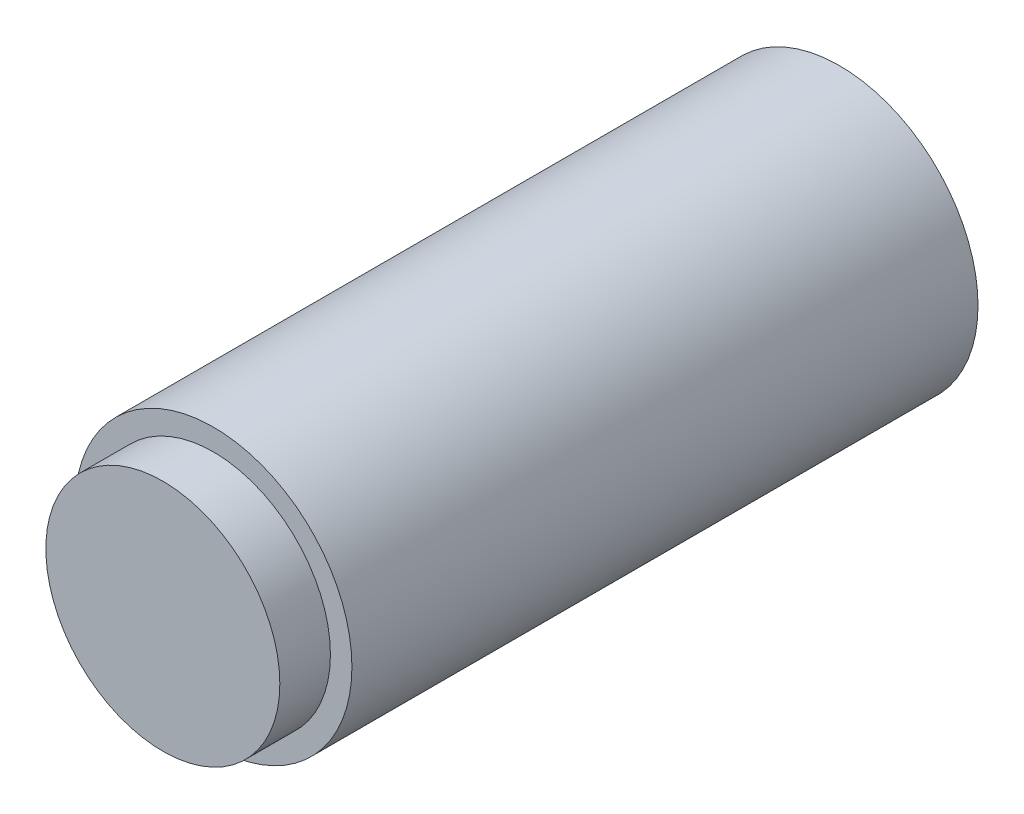
ISO-10303-21;
HEADER;
FILE_DESCRIPTION(('STEP AP214'),'2;1');
FILE_NAME('part.step','',(''),(''),'','','');
FILE_SCHEMA(('AUTOMOTIVE_DESIGN { 1 0 10303 214 1 1 1 1 }'));
ENDSEC;
DATA;
#1=APPLICATION_CONTEXT('core data for automotive mechanical design processes');
#2=APPLICATION_PROTOCOL_DEFINITION('international standard','automotive_design',2000,#1);
#3=PRODUCT_CONTEXT('',#1,'mechanical');
#4=PRODUCT('Part','Part','',(#3));
#5=PRODUCT_RELATED_PRODUCT_CATEGORY('part','',(#4));
#6=PRODUCT_DEFINITION_FORMATION('','',#4);
#7=PRODUCT_DEFINITION_CONTEXT('part definition',#1,'design');
#8=PRODUCT_DEFINITION('design','',#6,#7);
#9=PRODUCT_DEFINITION_SHAPE('','',#8);
#10=(LENGTH_UNIT() NAMED_UNIT(*) SI_UNIT(.MILLI.,.METRE.));
#11=(NAMED_UNIT(*) PLANE_ANGLE_UNIT() SI_UNIT($,.RADIAN.));
#12=(NAMED_UNIT(*) SI_UNIT($,.STERADIAN.) SOLID_ANGLE_UNIT());
#13=UNCERTAINTY_MEASURE_WITH_UNIT(LENGTH_MEASURE(1.E-05),#10,'distance_accuracy_value','');
#14=(GEOMETRIC_REPRESENTATION_CONTEXT(3) GLOBAL_UNCERTAINTY_ASSIGNED_CONTEXT((#13)) GLOBAL_UNIT_ASSIGNED_CONTEXT((#10,
#11,#12)) REPRESENTATION_CONTEXT('',''));
#15=CARTESIAN_POINT('',(0.,0.,0.));
#16=DIRECTION('',(0.,0.,1.));
#17=DIRECTION('',(1.,0.,0.));
#18=AXIS2_PLACEMENT_3D('',#15,#16,#17);
#19=CARTESIAN_POINT('',(0.,0.,49.5));
#20=DIRECTION('',(0.,0.,-1.));
#21=DIRECTION('',(-1.,0.,0.));
#22=AXIS2_PLACEMENT_3D('',#19,#20,#21);
#23=CYLINDRICAL_SURFACE('',#22,10.95);
#24=CARTESIAN_POINT('',(0.,0.,49.5));
#25=DIRECTION('',(0.,0.,1.));
#26=DIRECTION('',(1.,0.,0.));
#27=AXIS2_PLACEMENT_3D('',#24,#25,#26);
#28=CIRCLE('',#27,10.95);
#29=CARTESIAN_POINT('',(10.95,0.,49.5));
#30=VERTEX_POINT('',#29);
#31=EDGE_CURVE('E21',#30,#30,#28,.T.);
#32=ORIENTED_EDGE('',*,*,#31,.F.);
#33=EDGE_LOOP('',(#32));
#34=FACE_BOUND('',#33,.T.);
#35=CARTESIAN_POINT('',(0.,0.,0.));
#36=DIRECTION('',(0.,0.,1.));
#37=DIRECTION('',(1.,0.,0.));
#38=AXIS2_PLACEMENT_3D('',#35,#36,#37);
#39=CIRCLE('',#38,10.95);
#40=CARTESIAN_POINT('',(10.95,0.,0.));
#41=VERTEX_POINT('',#40);
#42=EDGE_CURVE('E17',#41,#41,#39,.T.);
#43=ORIENTED_EDGE('',*,*,#42,.T.);
#44=EDGE_LOOP('',(#43));
#45=FACE_BOUND('',#44,.T.);
#46=ADVANCED_FACE('F14',(#34,#45),#23,.T.);
#47=CARTESIAN_POINT('',(0.,0.,49.5));
#48=DIRECTION('',(0.,0.,1.));
#49=DIRECTION('',(1.,0.,0.));
#50=AXIS2_PLACEMENT_3D('',#47,#48,#49);
#51=PLANE('',#50);
#52=CARTESIAN_POINT('',(0.,0.,49.5));
#53=DIRECTION('',(0.,0.,1.));
#54=DIRECTION('',(1.,0.,0.));
#55=AXIS2_PLACEMENT_3D('',#52,#53,#54);
#56=CIRCLE('',#55,9.25);
#57=CARTESIAN_POINT('',(9.25,0.,49.5));
#58=VERTEX_POINT('',#57);
#59=EDGE_CURVE('E10',#58,#58,#56,.T.);
#60=ORIENTED_EDGE('',*,*,#59,.F.);
#61=EDGE_LOOP('',(#60));
#62=FACE_BOUND('',#61,.T.);
#63=ORIENTED_EDGE('',*,*,#31,.T.);
#64=EDGE_LOOP('',(#63));
#65=FACE_BOUND('',#64,.T.);
#66=ADVANCED_FACE('F38',(#62,#65),#51,.T.);
#67=CARTESIAN_POINT('',(0.,0.,0.));
#68=DIRECTION('',(0.,0.,1.));
#69=DIRECTION('',(1.,0.,0.));
#70=AXIS2_PLACEMENT_3D('',#67,#68,#69);
#71=PLANE('',#70);
#72=ORIENTED_EDGE('',*,*,#42,.F.);
#73=EDGE_LOOP('',(#72));
#74=FACE_BOUND('',#73,.T.);
#75=ADVANCED_FACE('F35',(#74),#71,.F.);
#76=CARTESIAN_POINT('',(0.,0.,53.5));
#77=DIRECTION('',(0.,0.,-1.));
#78=DIRECTION('',(-1.,0.,0.));
#79=AXIS2_PLACEMENT_3D('',#76,#77,#78);
#80=CYLINDRICAL_SURFACE('',#79,9.25);
#81=CARTESIAN_POINT('',(0.,0.,53.5));
#82=DIRECTION('',(0.,0.,1.));
#83=DIRECTION('',(1.,0.,0.));
#84=AXIS2_PLACEMENT_3D('',#81,#82,#83);
#85=CIRCLE('',#84,9.25);
#86=CARTESIAN_POINT('',(9.25,0.,53.5));
#87=VERTEX_POINT('',#86);
#88=EDGE_CURVE('E27',#87,#87,#85,.T.);
#89=ORIENTED_EDGE('',*,*,#88,.F.);
#90=EDGE_LOOP('',(#89));
#91=FACE_BOUND('',#90,.T.);
#92=ORIENTED_EDGE('',*,*,#59,.T.);
#93=EDGE_LOOP('',(#92));
#94=FACE_BOUND('',#93,.T.);
#95=ADVANCED_FACE('F37',(#91,#94),#80,.T.);
#96=CARTESIAN_POINT('',(0.,0.,53.5));
#97=DIRECTION('',(0.,0.,1.));
#98=DIRECTION('',(1.,0.,0.));
#99=AXIS2_PLACEMENT_3D('',#96,#97,#98);
#100=PLANE('',#99);
#101=ORIENTED_EDGE('',*,*,#88,.T.);
#102=EDGE_LOOP('',(#101));
#103=FACE_BOUND('',#102,.T.);
#104=ADVANCED_FACE('F44',(#103),#100,.T.);
#105=CLOSED_SHELL('',(#46,#66,#75,#95,#104));
#106=MANIFOLD_SOLID_BREP('B1',#105);
#107=ADVANCED_BREP_SHAPE_REPRESENTATION('',(#18,#106),#14);
#108=SHAPE_DEFINITION_REPRESENTATION(#9,#107);
ENDSEC;
END-ISO-10303-21;
